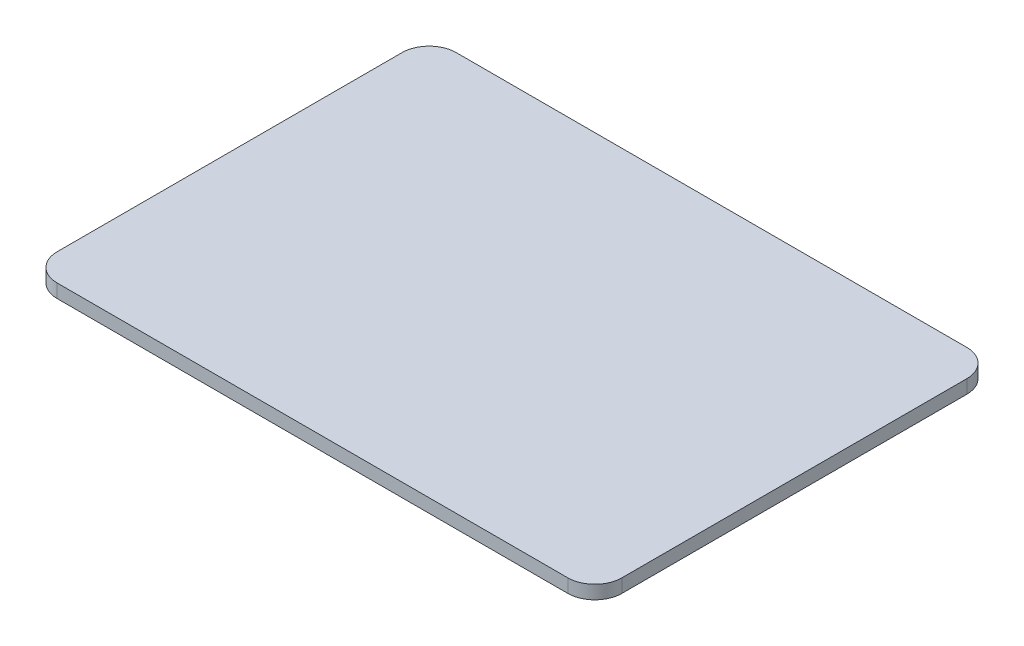
ISO-10303-21;
HEADER;
FILE_DESCRIPTION(('STEP AP214'),'2;1');
FILE_NAME('part.step','',(''),(''),'','','');
FILE_SCHEMA(('AUTOMOTIVE_DESIGN { 1 0 10303 214 1 1 1 1 }'));
ENDSEC;
DATA;
#1=APPLICATION_CONTEXT('core data for automotive mechanical design processes');
#2=APPLICATION_PROTOCOL_DEFINITION('international standard','automotive_design',2000,#1);
#3=PRODUCT_CONTEXT('',#1,'mechanical');
#4=PRODUCT('Part','Part','',(#3));
#5=PRODUCT_RELATED_PRODUCT_CATEGORY('part','',(#4));
#6=PRODUCT_DEFINITION_FORMATION('','',#4);
#7=PRODUCT_DEFINITION_CONTEXT('part definition',#1,'design');
#8=PRODUCT_DEFINITION('design','',#6,#7);
#9=PRODUCT_DEFINITION_SHAPE('','',#8);
#10=(LENGTH_UNIT() NAMED_UNIT(*) SI_UNIT(.MILLI.,.METRE.));
#11=(NAMED_UNIT(*) PLANE_ANGLE_UNIT() SI_UNIT($,.RADIAN.));
#12=(NAMED_UNIT(*) SI_UNIT($,.STERADIAN.) SOLID_ANGLE_UNIT());
#13=UNCERTAINTY_MEASURE_WITH_UNIT(LENGTH_MEASURE(1.E-05),#10,'distance_accuracy_value','');
#14=(GEOMETRIC_REPRESENTATION_CONTEXT(3) GLOBAL_UNCERTAINTY_ASSIGNED_CONTEXT((#13)) GLOBAL_UNIT_ASSIGNED_CONTEXT((#10,
#11,#12)) REPRESENTATION_CONTEXT('',''));
#15=CARTESIAN_POINT('',(0.,0.,0.));
#16=DIRECTION('',(0.,0.,1.));
#17=DIRECTION('',(1.,0.,0.));
#18=AXIS2_PLACEMENT_3D('',#15,#16,#17);
#19=CARTESIAN_POINT('',(132.55625,6.35,93.6625));
#20=DIRECTION('',(-1.,0.,0.));
#21=DIRECTION('',(0.,0.,1.));
#22=AXIS2_PLACEMENT_3D('',#19,#20,#21);
#23=PLANE('',#22);
#24=DIRECTION('',(0.,0.,-1.));
#25=VECTOR('',#24,1.);
#26=CARTESIAN_POINT('',(132.55625,0.,93.6625));
#27=LINE('',#26,#25);
#28=CARTESIAN_POINT('',(132.55625,0.,80.9625));
#29=VERTEX_POINT('',#28);
#30=CARTESIAN_POINT('',(132.55625,0.,-80.9624999999999));
#31=VERTEX_POINT('',#30);
#32=EDGE_CURVE('E127',#29,#31,#27,.T.);
#33=ORIENTED_EDGE('',*,*,#32,.T.);
#34=DIRECTION('',(0.,-1.,0.));
#35=VECTOR('',#34,1.);
#36=CARTESIAN_POINT('',(132.55625,6.35,-80.9625));
#37=LINE('',#36,#35);
#38=CARTESIAN_POINT('',(132.55625,6.35,-80.9624999999999));
#39=VERTEX_POINT('',#38);
#40=EDGE_CURVE('E150',#31,#39,#37,.F.);
#41=ORIENTED_EDGE('',*,*,#40,.T.);
#42=DIRECTION('',(0.,0.,-1.));
#43=VECTOR('',#42,1.);
#44=CARTESIAN_POINT('',(132.55625,6.35,93.6625));
#45=LINE('',#44,#43);
#46=CARTESIAN_POINT('',(132.55625,6.35,80.9625));
#47=VERTEX_POINT('',#46);
#48=EDGE_CURVE('E125',#47,#39,#45,.T.);
#49=ORIENTED_EDGE('',*,*,#48,.F.);
#50=DIRECTION('',(0.,-1.,0.));
#51=VECTOR('',#50,1.);
#52=CARTESIAN_POINT('',(132.55625,6.35,80.9625));
#53=LINE('',#52,#51);
#54=EDGE_CURVE('E147',#47,#29,#53,.T.);
#55=ORIENTED_EDGE('',*,*,#54,.T.);
#56=EDGE_LOOP('',(#33,#41,#49,#55));
#57=FACE_BOUND('',#56,.T.);
#58=ADVANCED_FACE('F32',(#57),#23,.F.);
#59=CARTESIAN_POINT('',(-132.55625,6.35,-93.6625));
#60=DIRECTION('',(0.,0.,1.));
#61=DIRECTION('',(1.,0.,0.));
#62=AXIS2_PLACEMENT_3D('',#59,#60,#61);
#63=PLANE('',#62);
#64=DIRECTION('',(-1.,0.,0.));
#65=VECTOR('',#64,1.);
#66=CARTESIAN_POINT('',(-132.55625,0.,-93.6625));
#67=LINE('',#66,#65);
#68=CARTESIAN_POINT('',(119.85625,0.,-93.6625));
#69=VERTEX_POINT('',#68);
#70=CARTESIAN_POINT('',(-119.85625,0.,-93.6625));
#71=VERTEX_POINT('',#70);
#72=EDGE_CURVE('E123',#69,#71,#67,.T.);
#73=ORIENTED_EDGE('',*,*,#72,.T.);
#74=DIRECTION('',(0.,-1.,0.));
#75=VECTOR('',#74,1.);
#76=CARTESIAN_POINT('',(-119.85625,6.35,-93.6625));
#77=LINE('',#76,#75);
#78=CARTESIAN_POINT('',(-119.85625,6.35,-93.6625));
#79=VERTEX_POINT('',#78);
#80=EDGE_CURVE('E102',#71,#79,#77,.F.);
#81=ORIENTED_EDGE('',*,*,#80,.T.);
#82=DIRECTION('',(-1.,0.,0.));
#83=VECTOR('',#82,1.);
#84=CARTESIAN_POINT('',(-132.55625,6.35,-93.6625));
#85=LINE('',#84,#83);
#86=CARTESIAN_POINT('',(119.85625,6.35,-93.6625));
#87=VERTEX_POINT('',#86);
#88=EDGE_CURVE('E166',#87,#79,#85,.T.);
#89=ORIENTED_EDGE('',*,*,#88,.F.);
#90=DIRECTION('',(0.,-1.,0.));
#91=VECTOR('',#90,1.);
#92=CARTESIAN_POINT('',(119.85625,6.35,-93.6625));
#93=LINE('',#92,#91);
#94=EDGE_CURVE('E107',#87,#69,#93,.T.);
#95=ORIENTED_EDGE('',*,*,#94,.T.);
#96=EDGE_LOOP('',(#73,#81,#89,#95));
#97=FACE_BOUND('',#96,.T.);
#98=ADVANCED_FACE('F183',(#97),#63,.F.);
#99=CARTESIAN_POINT('',(-132.55625,6.35,93.6625));
#100=DIRECTION('',(1.,0.,0.));
#101=DIRECTION('',(0.,0.,-1.));
#102=AXIS2_PLACEMENT_3D('',#99,#100,#101);
#103=PLANE('',#102);
#104=DIRECTION('',(0.,0.,1.));
#105=VECTOR('',#104,1.);
#106=CARTESIAN_POINT('',(-132.55625,6.35,93.6625));
#107=LINE('',#106,#105);
#108=CARTESIAN_POINT('',(-132.55625,6.35,-80.9624999999999));
#109=VERTEX_POINT('',#108);
#110=CARTESIAN_POINT('',(-132.55625,6.35,80.9625));
#111=VERTEX_POINT('',#110);
#112=EDGE_CURVE('E116',#109,#111,#107,.T.);
#113=ORIENTED_EDGE('',*,*,#112,.F.);
#114=DIRECTION('',(0.,-1.,0.));
#115=VECTOR('',#114,1.);
#116=CARTESIAN_POINT('',(-132.55625,6.35,-80.9625));
#117=LINE('',#116,#115);
#118=CARTESIAN_POINT('',(-132.55625,0.,-80.9624999999999));
#119=VERTEX_POINT('',#118);
#120=EDGE_CURVE('E101',#109,#119,#117,.T.);
#121=ORIENTED_EDGE('',*,*,#120,.T.);
#122=DIRECTION('',(0.,0.,1.));
#123=VECTOR('',#122,1.);
#124=CARTESIAN_POINT('',(-132.55625,0.,93.6625));
#125=LINE('',#124,#123);
#126=CARTESIAN_POINT('',(-132.55625,0.,80.9625));
#127=VERTEX_POINT('',#126);
#128=EDGE_CURVE('E114',#119,#127,#125,.T.);
#129=ORIENTED_EDGE('',*,*,#128,.T.);
#130=DIRECTION('',(0.,-1.,0.));
#131=VECTOR('',#130,1.);
#132=CARTESIAN_POINT('',(-132.55625,6.35,80.9625));
#133=LINE('',#132,#131);
#134=EDGE_CURVE('E118',#127,#111,#133,.F.);
#135=ORIENTED_EDGE('',*,*,#134,.T.);
#136=EDGE_LOOP('',(#113,#121,#129,#135));
#137=FACE_BOUND('',#136,.T.);
#138=ADVANCED_FACE('F113',(#137),#103,.F.);
#139=CARTESIAN_POINT('',(-132.55625,6.35,93.6625));
#140=DIRECTION('',(0.,0.,-1.));
#141=DIRECTION('',(-1.,0.,0.));
#142=AXIS2_PLACEMENT_3D('',#139,#140,#141);
#143=PLANE('',#142);
#144=DIRECTION('',(1.,0.,0.));
#145=VECTOR('',#144,1.);
#146=CARTESIAN_POINT('',(-132.55625,0.,93.6625));
#147=LINE('',#146,#145);
#148=CARTESIAN_POINT('',(-119.85625,0.,93.6625));
#149=VERTEX_POINT('',#148);
#150=CARTESIAN_POINT('',(119.85625,0.,93.6625));
#151=VERTEX_POINT('',#150);
#152=EDGE_CURVE('E122',#149,#151,#147,.T.);
#153=ORIENTED_EDGE('',*,*,#152,.T.);
#154=DIRECTION('',(0.,-1.,0.));
#155=VECTOR('',#154,1.);
#156=CARTESIAN_POINT('',(119.85625,6.35,93.6625));
#157=LINE('',#156,#155);
#158=CARTESIAN_POINT('',(119.85625,6.35,93.6625));
#159=VERTEX_POINT('',#158);
#160=EDGE_CURVE('E11',#151,#159,#157,.F.);
#161=ORIENTED_EDGE('',*,*,#160,.T.);
#162=DIRECTION('',(1.,0.,0.));
#163=VECTOR('',#162,1.);
#164=CARTESIAN_POINT('',(-132.55625,6.35,93.6625));
#165=LINE('',#164,#163);
#166=CARTESIAN_POINT('',(-119.85625,6.35,93.6625));
#167=VERTEX_POINT('',#166);
#168=EDGE_CURVE('E131',#167,#159,#165,.T.);
#169=ORIENTED_EDGE('',*,*,#168,.F.);
#170=DIRECTION('',(0.,-1.,0.));
#171=VECTOR('',#170,1.);
#172=CARTESIAN_POINT('',(-119.85625,6.35,93.6625));
#173=LINE('',#172,#171);
#174=EDGE_CURVE('E40',#167,#149,#173,.T.);
#175=ORIENTED_EDGE('',*,*,#174,.T.);
#176=EDGE_LOOP('',(#153,#161,#169,#175));
#177=FACE_BOUND('',#176,.T.);
#178=ADVANCED_FACE('F153',(#177),#143,.F.);
#179=CARTESIAN_POINT('',(0.,6.35,0.));
#180=DIRECTION('',(0.,-1.,0.));
#181=DIRECTION('',(0.,0.,-1.));
#182=AXIS2_PLACEMENT_3D('',#179,#180,#181);
#183=PLANE('',#182);
#184=ORIENTED_EDGE('',*,*,#88,.T.);
#185=CARTESIAN_POINT('',(-119.85625,6.35,-80.9625));
#186=DIRECTION('',(0.,-1.,0.));
#187=DIRECTION('',(0.,0.,-1.));
#188=AXIS2_PLACEMENT_3D('',#185,#186,#187);
#189=CIRCLE('',#188,12.7);
#190=EDGE_CURVE('E145',#79,#109,#189,.F.);
#191=ORIENTED_EDGE('',*,*,#190,.T.);
#192=ORIENTED_EDGE('',*,*,#112,.T.);
#193=CARTESIAN_POINT('',(-119.85625,6.35,80.9625));
#194=DIRECTION('',(0.,-1.,0.));
#195=DIRECTION('',(0.,0.,-1.));
#196=AXIS2_PLACEMENT_3D('',#193,#194,#195);
#197=CIRCLE('',#196,12.7);
#198=EDGE_CURVE('E52',#111,#167,#197,.F.);
#199=ORIENTED_EDGE('',*,*,#198,.T.);
#200=ORIENTED_EDGE('',*,*,#168,.T.);
#201=CARTESIAN_POINT('',(119.85625,6.35,80.9625));
#202=DIRECTION('',(0.,-1.,0.));
#203=DIRECTION('',(0.,0.,-1.));
#204=AXIS2_PLACEMENT_3D('',#201,#202,#203);
#205=CIRCLE('',#204,12.7);
#206=EDGE_CURVE('E141',#159,#47,#205,.F.);
#207=ORIENTED_EDGE('',*,*,#206,.T.);
#208=ORIENTED_EDGE('',*,*,#48,.T.);
#209=CARTESIAN_POINT('',(119.85625,6.35,-80.9625));
#210=DIRECTION('',(0.,-1.,0.));
#211=DIRECTION('',(0.,0.,-1.));
#212=AXIS2_PLACEMENT_3D('',#209,#210,#211);
#213=CIRCLE('',#212,12.7);
#214=EDGE_CURVE('E143',#39,#87,#213,.F.);
#215=ORIENTED_EDGE('',*,*,#214,.T.);
#216=EDGE_LOOP('',(#184,#191,#192,#199,#200,#207,#208,#215));
#217=FACE_BOUND('',#216,.T.);
#218=ADVANCED_FACE('F172',(#217),#183,.F.);
#219=CARTESIAN_POINT('',(0.,0.,0.));
#220=DIRECTION('',(0.,-1.,0.));
#221=DIRECTION('',(0.,0.,-1.));
#222=AXIS2_PLACEMENT_3D('',#219,#220,#221);
#223=PLANE('',#222);
#224=ORIENTED_EDGE('',*,*,#128,.F.);
#225=CARTESIAN_POINT('',(-119.85625,0.,-80.9625));
#226=DIRECTION('',(0.,-1.,0.));
#227=DIRECTION('',(0.,0.,-1.));
#228=AXIS2_PLACEMENT_3D('',#225,#226,#227);
#229=CIRCLE('',#228,12.7);
#230=EDGE_CURVE('E97',#119,#71,#229,.T.);
#231=ORIENTED_EDGE('',*,*,#230,.T.);
#232=ORIENTED_EDGE('',*,*,#72,.F.);
#233=CARTESIAN_POINT('',(119.85625,0.,-80.9625));
#234=DIRECTION('',(0.,-1.,0.));
#235=DIRECTION('',(0.,0.,-1.));
#236=AXIS2_PLACEMENT_3D('',#233,#234,#235);
#237=CIRCLE('',#236,12.7);
#238=EDGE_CURVE('E108',#69,#31,#237,.T.);
#239=ORIENTED_EDGE('',*,*,#238,.T.);
#240=ORIENTED_EDGE('',*,*,#32,.F.);
#241=CARTESIAN_POINT('',(119.85625,0.,80.9625));
#242=DIRECTION('',(0.,-1.,0.));
#243=DIRECTION('',(0.,0.,-1.));
#244=AXIS2_PLACEMENT_3D('',#241,#242,#243);
#245=CIRCLE('',#244,12.7);
#246=EDGE_CURVE('E134',#29,#151,#245,.T.);
#247=ORIENTED_EDGE('',*,*,#246,.T.);
#248=ORIENTED_EDGE('',*,*,#152,.F.);
#249=CARTESIAN_POINT('',(-119.85625,0.,80.9625));
#250=DIRECTION('',(0.,-1.,0.));
#251=DIRECTION('',(0.,0.,-1.));
#252=AXIS2_PLACEMENT_3D('',#249,#250,#251);
#253=CIRCLE('',#252,12.7);
#254=EDGE_CURVE('E117',#149,#127,#253,.T.);
#255=ORIENTED_EDGE('',*,*,#254,.T.);
#256=EDGE_LOOP('',(#224,#231,#232,#239,#240,#247,#248,#255));
#257=FACE_BOUND('',#256,.T.);
#258=ADVANCED_FACE('F120',(#257),#223,.T.);
#259=CARTESIAN_POINT('',(-119.85625,6.35,-80.9625));
#260=DIRECTION('',(0.,-1.,0.));
#261=DIRECTION('',(0.,0.,-1.));
#262=AXIS2_PLACEMENT_3D('',#259,#260,#261);
#263=CYLINDRICAL_SURFACE('',#262,12.7);
#264=ORIENTED_EDGE('',*,*,#190,.F.);
#265=ORIENTED_EDGE('',*,*,#80,.F.);
#266=ORIENTED_EDGE('',*,*,#230,.F.);
#267=ORIENTED_EDGE('',*,*,#120,.F.);
#268=EDGE_LOOP('',(#264,#265,#266,#267));
#269=FACE_BOUND('',#268,.T.);
#270=ADVANCED_FACE('F100',(#269),#263,.T.);
#271=CARTESIAN_POINT('',(119.85625,6.35,-80.9625));
#272=DIRECTION('',(0.,-1.,0.));
#273=DIRECTION('',(0.,0.,-1.));
#274=AXIS2_PLACEMENT_3D('',#271,#272,#273);
#275=CYLINDRICAL_SURFACE('',#274,12.7);
#276=ORIENTED_EDGE('',*,*,#214,.F.);
#277=ORIENTED_EDGE('',*,*,#40,.F.);
#278=ORIENTED_EDGE('',*,*,#238,.F.);
#279=ORIENTED_EDGE('',*,*,#94,.F.);
#280=EDGE_LOOP('',(#276,#277,#278,#279));
#281=FACE_BOUND('',#280,.T.);
#282=ADVANCED_FACE('F194',(#281),#275,.T.);
#283=CARTESIAN_POINT('',(119.85625,6.35,80.9625));
#284=DIRECTION('',(0.,-1.,0.));
#285=DIRECTION('',(0.,0.,-1.));
#286=AXIS2_PLACEMENT_3D('',#283,#284,#285);
#287=CYLINDRICAL_SURFACE('',#286,12.7);
#288=ORIENTED_EDGE('',*,*,#206,.F.);
#289=ORIENTED_EDGE('',*,*,#160,.F.);
#290=ORIENTED_EDGE('',*,*,#246,.F.);
#291=ORIENTED_EDGE('',*,*,#54,.F.);
#292=EDGE_LOOP('',(#288,#289,#290,#291));
#293=FACE_BOUND('',#292,.T.);
#294=ADVANCED_FACE('F160',(#293),#287,.T.);
#295=CARTESIAN_POINT('',(-119.85625,6.35,80.9625));
#296=DIRECTION('',(0.,-1.,0.));
#297=DIRECTION('',(0.,0.,-1.));
#298=AXIS2_PLACEMENT_3D('',#295,#296,#297);
#299=CYLINDRICAL_SURFACE('',#298,12.7);
#300=ORIENTED_EDGE('',*,*,#198,.F.);
#301=ORIENTED_EDGE('',*,*,#134,.F.);
#302=ORIENTED_EDGE('',*,*,#254,.F.);
#303=ORIENTED_EDGE('',*,*,#174,.F.);
#304=EDGE_LOOP('',(#300,#301,#302,#303));
#305=FACE_BOUND('',#304,.T.);
#306=ADVANCED_FACE('F34',(#305),#299,.T.);
#307=CLOSED_SHELL('',(#58,#98,#138,#178,#218,#258,#270,#282,#294,#306));
#308=MANIFOLD_SOLID_BREP('B2',#307);
#309=ADVANCED_BREP_SHAPE_REPRESENTATION('',(#18,#308),#14);
#310=SHAPE_DEFINITION_REPRESENTATION(#9,#309);
ENDSEC;
END-ISO-10303-21;
